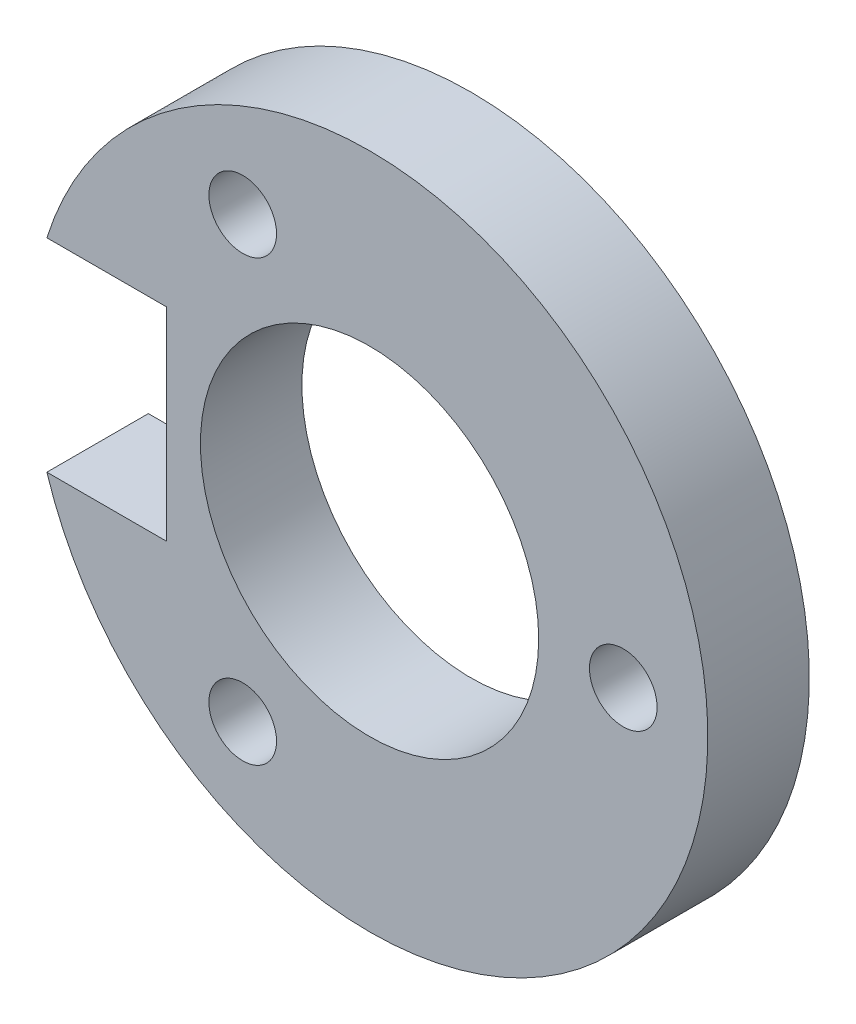
ISO-10303-21;
HEADER;
FILE_DESCRIPTION(('STEP AP214'),'2;1');
FILE_NAME('part.step','',(''),(''),'','','');
FILE_SCHEMA(('AUTOMOTIVE_DESIGN { 1 0 10303 214 1 1 1 1 }'));
ENDSEC;
DATA;
#1=APPLICATION_CONTEXT('core data for automotive mechanical design processes');
#2=APPLICATION_PROTOCOL_DEFINITION('international standard','automotive_design',2000,#1);
#3=PRODUCT_CONTEXT('',#1,'mechanical');
#4=PRODUCT('Part','Part','',(#3));
#5=PRODUCT_RELATED_PRODUCT_CATEGORY('part','',(#4));
#6=PRODUCT_DEFINITION_FORMATION('','',#4);
#7=PRODUCT_DEFINITION_CONTEXT('part definition',#1,'design');
#8=PRODUCT_DEFINITION('design','',#6,#7);
#9=PRODUCT_DEFINITION_SHAPE('','',#8);
#10=(LENGTH_UNIT() NAMED_UNIT(*) SI_UNIT(.MILLI.,.METRE.));
#11=(NAMED_UNIT(*) PLANE_ANGLE_UNIT() SI_UNIT($,.RADIAN.));
#12=(NAMED_UNIT(*) SI_UNIT($,.STERADIAN.) SOLID_ANGLE_UNIT());
#13=UNCERTAINTY_MEASURE_WITH_UNIT(LENGTH_MEASURE(1.E-05),#10,'distance_accuracy_value','');
#14=(GEOMETRIC_REPRESENTATION_CONTEXT(3) GLOBAL_UNCERTAINTY_ASSIGNED_CONTEXT((#13)) GLOBAL_UNIT_ASSIGNED_CONTEXT((#10,
#11,#12)) REPRESENTATION_CONTEXT('',''));
#15=CARTESIAN_POINT('',(0.,0.,0.));
#16=DIRECTION('',(0.,0.,1.));
#17=DIRECTION('',(1.,0.,0.));
#18=AXIS2_PLACEMENT_3D('',#15,#16,#17);
#19=CARTESIAN_POINT('',(-6.,0.,3.));
#20=DIRECTION('',(1.,0.,0.));
#21=DIRECTION('',(0.,0.,-1.));
#22=AXIS2_PLACEMENT_3D('',#19,#20,#21);
#23=PLANE('',#22);
#24=DIRECTION('',(0.,-1.,0.));
#25=VECTOR('',#24,1.);
#26=CARTESIAN_POINT('',(-6.,0.,0.));
#27=LINE('',#26,#25);
#28=CARTESIAN_POINT('',(-6.,3.,0.));
#29=VERTEX_POINT('',#28);
#30=CARTESIAN_POINT('',(-6.,-3.,0.));
#31=VERTEX_POINT('',#30);
#32=EDGE_CURVE('E115',#29,#31,#27,.T.);
#33=ORIENTED_EDGE('',*,*,#32,.T.);
#34=DIRECTION('',(0.,0.,-1.));
#35=VECTOR('',#34,1.);
#36=CARTESIAN_POINT('',(-6.,-3.,3.));
#37=LINE('',#36,#35);
#38=CARTESIAN_POINT('',(-6.,-3.,3.));
#39=VERTEX_POINT('',#38);
#40=EDGE_CURVE('E11',#39,#31,#37,.T.);
#41=ORIENTED_EDGE('',*,*,#40,.F.);
#42=DIRECTION('',(0.,-1.,0.));
#43=VECTOR('',#42,1.);
#44=CARTESIAN_POINT('',(-6.,0.,3.));
#45=LINE('',#44,#43);
#46=CARTESIAN_POINT('',(-6.,3.,3.));
#47=VERTEX_POINT('',#46);
#48=EDGE_CURVE('E80',#47,#39,#45,.T.);
#49=ORIENTED_EDGE('',*,*,#48,.F.);
#50=DIRECTION('',(0.,0.,-1.));
#51=VECTOR('',#50,1.);
#52=CARTESIAN_POINT('',(-6.,3.,3.));
#53=LINE('',#52,#51);
#54=EDGE_CURVE('E102',#47,#29,#53,.T.);
#55=ORIENTED_EDGE('',*,*,#54,.T.);
#56=EDGE_LOOP('',(#33,#41,#49,#55));
#57=FACE_BOUND('',#56,.T.);
#58=ADVANCED_FACE('F37',(#57),#23,.F.);
#59=CARTESIAN_POINT('',(0.,-3.,3.));
#60=DIRECTION('',(0.,1.,0.));
#61=DIRECTION('',(0.,0.,1.));
#62=AXIS2_PLACEMENT_3D('',#59,#60,#61);
#63=PLANE('',#62);
#64=DIRECTION('',(1.,0.,0.));
#65=VECTOR('',#64,1.);
#66=CARTESIAN_POINT('',(0.,-3.,0.));
#67=LINE('',#66,#65);
#68=CARTESIAN_POINT('',(-9.53939201416945,-3.,0.));
#69=VERTEX_POINT('',#68);
#70=EDGE_CURVE('E90',#69,#31,#67,.T.);
#71=ORIENTED_EDGE('',*,*,#70,.F.);
#72=DIRECTION('',(0.,0.,-1.));
#73=VECTOR('',#72,1.);
#74=CARTESIAN_POINT('',(-9.53939201416945,-3.,3.));
#75=LINE('',#74,#73);
#76=CARTESIAN_POINT('',(-9.53939201416945,-3.,3.));
#77=VERTEX_POINT('',#76);
#78=EDGE_CURVE('E46',#77,#69,#75,.T.);
#79=ORIENTED_EDGE('',*,*,#78,.F.);
#80=DIRECTION('',(1.,0.,0.));
#81=VECTOR('',#80,1.);
#82=CARTESIAN_POINT('',(0.,-3.,3.));
#83=LINE('',#82,#81);
#84=EDGE_CURVE('E88',#77,#39,#83,.T.);
#85=ORIENTED_EDGE('',*,*,#84,.T.);
#86=ORIENTED_EDGE('',*,*,#40,.T.);
#87=EDGE_LOOP('',(#71,#79,#85,#86));
#88=FACE_BOUND('',#87,.T.);
#89=ADVANCED_FACE('F87',(#88),#63,.T.);
#90=CARTESIAN_POINT('',(0.,0.,3.));
#91=DIRECTION('',(0.,0.,-1.));
#92=DIRECTION('',(-1.,0.,0.));
#93=AXIS2_PLACEMENT_3D('',#90,#91,#92);
#94=CYLINDRICAL_SURFACE('',#93,10.);
#95=CARTESIAN_POINT('',(0.,0.,0.));
#96=DIRECTION('',(0.,0.,1.));
#97=DIRECTION('',(1.,0.,0.));
#98=AXIS2_PLACEMENT_3D('',#95,#96,#97);
#99=CIRCLE('',#98,10.);
#100=CARTESIAN_POINT('',(-9.53939201416945,3.,0.));
#101=VERTEX_POINT('',#100);
#102=EDGE_CURVE('E69',#69,#101,#99,.T.);
#103=ORIENTED_EDGE('',*,*,#102,.T.);
#104=DIRECTION('',(0.,0.,-1.));
#105=VECTOR('',#104,1.);
#106=CARTESIAN_POINT('',(-9.53939201416945,3.,3.));
#107=LINE('',#106,#105);
#108=CARTESIAN_POINT('',(-9.53939201416945,3.,3.));
#109=VERTEX_POINT('',#108);
#110=EDGE_CURVE('E91',#109,#101,#107,.T.);
#111=ORIENTED_EDGE('',*,*,#110,.F.);
#112=CARTESIAN_POINT('',(0.,0.,3.));
#113=DIRECTION('',(0.,0.,1.));
#114=DIRECTION('',(1.,0.,0.));
#115=AXIS2_PLACEMENT_3D('',#112,#113,#114);
#116=CIRCLE('',#115,10.);
#117=EDGE_CURVE('E92',#77,#109,#116,.T.);
#118=ORIENTED_EDGE('',*,*,#117,.F.);
#119=ORIENTED_EDGE('',*,*,#78,.T.);
#120=EDGE_LOOP('',(#103,#111,#118,#119));
#121=FACE_BOUND('',#120,.T.);
#122=ADVANCED_FACE('F93',(#121),#94,.T.);
#123=CARTESIAN_POINT('',(7.5,0.,3.));
#124=DIRECTION('',(0.,0.,-1.));
#125=DIRECTION('',(-1.,0.,0.));
#126=AXIS2_PLACEMENT_3D('',#123,#124,#125);
#127=CYLINDRICAL_SURFACE('',#126,1.);
#128=CARTESIAN_POINT('',(7.5,0.,3.));
#129=DIRECTION('',(0.,0.,1.));
#130=DIRECTION('',(1.,0.,0.));
#131=AXIS2_PLACEMENT_3D('',#128,#129,#130);
#132=CIRCLE('',#131,1.);
#133=CARTESIAN_POINT('',(8.5,0.,3.));
#134=VERTEX_POINT('',#133);
#135=EDGE_CURVE('E97',#134,#134,#132,.T.);
#136=ORIENTED_EDGE('',*,*,#135,.T.);
#137=EDGE_LOOP('',(#136));
#138=FACE_BOUND('',#137,.T.);
#139=CARTESIAN_POINT('',(7.5,0.,0.));
#140=DIRECTION('',(0.,0.,1.));
#141=DIRECTION('',(1.,0.,0.));
#142=AXIS2_PLACEMENT_3D('',#139,#140,#141);
#143=CIRCLE('',#142,1.);
#144=CARTESIAN_POINT('',(8.5,0.,0.));
#145=VERTEX_POINT('',#144);
#146=EDGE_CURVE('E112',#145,#145,#143,.T.);
#147=ORIENTED_EDGE('',*,*,#146,.F.);
#148=EDGE_LOOP('',(#147));
#149=FACE_BOUND('',#148,.T.);
#150=ADVANCED_FACE('F136',(#138,#149),#127,.F.);
#151=CARTESIAN_POINT('',(-3.75000000000003,6.49519052838327,3.));
#152=DIRECTION('',(0.,0.,-1.));
#153=DIRECTION('',(-1.,0.,0.));
#154=AXIS2_PLACEMENT_3D('',#151,#152,#153);
#155=CYLINDRICAL_SURFACE('',#154,1.);
#156=CARTESIAN_POINT('',(-3.75000000000003,6.49519052838327,3.));
#157=DIRECTION('',(0.,0.,1.));
#158=DIRECTION('',(1.,0.,0.));
#159=AXIS2_PLACEMENT_3D('',#156,#157,#158);
#160=CIRCLE('',#159,1.);
#161=CARTESIAN_POINT('',(-2.75000000000003,6.49519052838327,3.));
#162=VERTEX_POINT('',#161);
#163=EDGE_CURVE('E272',#162,#162,#160,.T.);
#164=ORIENTED_EDGE('',*,*,#163,.T.);
#165=EDGE_LOOP('',(#164));
#166=FACE_BOUND('',#165,.T.);
#167=CARTESIAN_POINT('',(-3.75000000000003,6.49519052838327,0.));
#168=DIRECTION('',(0.,0.,1.));
#169=DIRECTION('',(1.,0.,0.));
#170=AXIS2_PLACEMENT_3D('',#167,#168,#169);
#171=CIRCLE('',#170,1.);
#172=CARTESIAN_POINT('',(-2.75000000000003,6.49519052838327,0.));
#173=VERTEX_POINT('',#172);
#174=EDGE_CURVE('E109',#173,#173,#171,.T.);
#175=ORIENTED_EDGE('',*,*,#174,.F.);
#176=EDGE_LOOP('',(#175));
#177=FACE_BOUND('',#176,.T.);
#178=ADVANCED_FACE('F139',(#166,#177),#155,.F.);
#179=CARTESIAN_POINT('',(0.,0.,3.));
#180=DIRECTION('',(0.,0.,-1.));
#181=DIRECTION('',(-1.,0.,0.));
#182=AXIS2_PLACEMENT_3D('',#179,#180,#181);
#183=CYLINDRICAL_SURFACE('',#182,5.);
#184=CARTESIAN_POINT('',(0.,0.,3.));
#185=DIRECTION('',(0.,0.,1.));
#186=DIRECTION('',(1.,0.,0.));
#187=AXIS2_PLACEMENT_3D('',#184,#185,#186);
#188=CIRCLE('',#187,5.);
#189=CARTESIAN_POINT('',(5.,0.,3.));
#190=VERTEX_POINT('',#189);
#191=EDGE_CURVE('E153',#190,#190,#188,.T.);
#192=ORIENTED_EDGE('',*,*,#191,.T.);
#193=EDGE_LOOP('',(#192));
#194=FACE_BOUND('',#193,.T.);
#195=CARTESIAN_POINT('',(0.,0.,0.));
#196=DIRECTION('',(0.,0.,1.));
#197=DIRECTION('',(1.,0.,0.));
#198=AXIS2_PLACEMENT_3D('',#195,#196,#197);
#199=CIRCLE('',#198,5.);
#200=CARTESIAN_POINT('',(5.,0.,0.));
#201=VERTEX_POINT('',#200);
#202=EDGE_CURVE('E106',#201,#201,#199,.T.);
#203=ORIENTED_EDGE('',*,*,#202,.F.);
#204=EDGE_LOOP('',(#203));
#205=FACE_BOUND('',#204,.T.);
#206=ADVANCED_FACE('F142',(#194,#205),#183,.F.);
#207=CARTESIAN_POINT('',(-3.74999999999994,-6.49519052838332,3.));
#208=DIRECTION('',(0.,0.,-1.));
#209=DIRECTION('',(-1.,0.,0.));
#210=AXIS2_PLACEMENT_3D('',#207,#208,#209);
#211=CYLINDRICAL_SURFACE('',#210,1.);
#212=CARTESIAN_POINT('',(-3.74999999999994,-6.49519052838332,3.));
#213=DIRECTION('',(0.,0.,1.));
#214=DIRECTION('',(1.,0.,0.));
#215=AXIS2_PLACEMENT_3D('',#212,#213,#214);
#216=CIRCLE('',#215,1.);
#217=CARTESIAN_POINT('',(-2.74999999999994,-6.49519052838332,3.));
#218=VERTEX_POINT('',#217);
#219=EDGE_CURVE('E121',#218,#218,#216,.T.);
#220=ORIENTED_EDGE('',*,*,#219,.T.);
#221=EDGE_LOOP('',(#220));
#222=FACE_BOUND('',#221,.T.);
#223=CARTESIAN_POINT('',(-3.74999999999994,-6.49519052838332,0.));
#224=DIRECTION('',(0.,0.,1.));
#225=DIRECTION('',(1.,0.,0.));
#226=AXIS2_PLACEMENT_3D('',#223,#224,#225);
#227=CIRCLE('',#226,1.);
#228=CARTESIAN_POINT('',(-2.74999999999994,-6.49519052838332,0.));
#229=VERTEX_POINT('',#228);
#230=EDGE_CURVE('E103',#229,#229,#227,.T.);
#231=ORIENTED_EDGE('',*,*,#230,.F.);
#232=EDGE_LOOP('',(#231));
#233=FACE_BOUND('',#232,.T.);
#234=ADVANCED_FACE('F39',(#222,#233),#211,.F.);
#235=CARTESIAN_POINT('',(0.,3.,3.));
#236=DIRECTION('',(0.,1.,0.));
#237=DIRECTION('',(0.,0.,1.));
#238=AXIS2_PLACEMENT_3D('',#235,#236,#237);
#239=PLANE('',#238);
#240=DIRECTION('',(1.,0.,0.));
#241=VECTOR('',#240,1.);
#242=CARTESIAN_POINT('',(0.,3.,0.));
#243=LINE('',#242,#241);
#244=EDGE_CURVE('E75',#101,#29,#243,.T.);
#245=ORIENTED_EDGE('',*,*,#244,.T.);
#246=ORIENTED_EDGE('',*,*,#54,.F.);
#247=DIRECTION('',(1.,0.,0.));
#248=VECTOR('',#247,1.);
#249=CARTESIAN_POINT('',(0.,3.,3.));
#250=LINE('',#249,#248);
#251=EDGE_CURVE('E54',#109,#47,#250,.T.);
#252=ORIENTED_EDGE('',*,*,#251,.F.);
#253=ORIENTED_EDGE('',*,*,#110,.T.);
#254=EDGE_LOOP('',(#245,#246,#252,#253));
#255=FACE_BOUND('',#254,.T.);
#256=ADVANCED_FACE('F123',(#255),#239,.F.);
#257=CARTESIAN_POINT('',(0.,0.,3.));
#258=DIRECTION('',(0.,0.,1.));
#259=DIRECTION('',(1.,0.,0.));
#260=AXIS2_PLACEMENT_3D('',#257,#258,#259);
#261=PLANE('',#260);
#262=ORIENTED_EDGE('',*,*,#219,.F.);
#263=EDGE_LOOP('',(#262));
#264=FACE_BOUND('',#263,.T.);
#265=ORIENTED_EDGE('',*,*,#191,.F.);
#266=EDGE_LOOP('',(#265));
#267=FACE_BOUND('',#266,.T.);
#268=ORIENTED_EDGE('',*,*,#163,.F.);
#269=EDGE_LOOP('',(#268));
#270=FACE_BOUND('',#269,.T.);
#271=ORIENTED_EDGE('',*,*,#135,.F.);
#272=EDGE_LOOP('',(#271));
#273=FACE_BOUND('',#272,.T.);
#274=ORIENTED_EDGE('',*,*,#48,.T.);
#275=ORIENTED_EDGE('',*,*,#84,.F.);
#276=ORIENTED_EDGE('',*,*,#117,.T.);
#277=ORIENTED_EDGE('',*,*,#251,.T.);
#278=EDGE_LOOP('',(#274,#275,#276,#277));
#279=FACE_BOUND('',#278,.T.);
#280=ADVANCED_FACE('F95',(#264,#267,#270,#273,#279),#261,.T.);
#281=CARTESIAN_POINT('',(0.,0.,0.));
#282=DIRECTION('',(0.,0.,1.));
#283=DIRECTION('',(1.,0.,0.));
#284=AXIS2_PLACEMENT_3D('',#281,#282,#283);
#285=PLANE('',#284);
#286=ORIENTED_EDGE('',*,*,#230,.T.);
#287=EDGE_LOOP('',(#286));
#288=FACE_BOUND('',#287,.T.);
#289=ORIENTED_EDGE('',*,*,#202,.T.);
#290=EDGE_LOOP('',(#289));
#291=FACE_BOUND('',#290,.T.);
#292=ORIENTED_EDGE('',*,*,#174,.T.);
#293=EDGE_LOOP('',(#292));
#294=FACE_BOUND('',#293,.T.);
#295=ORIENTED_EDGE('',*,*,#146,.T.);
#296=EDGE_LOOP('',(#295));
#297=FACE_BOUND('',#296,.T.);
#298=ORIENTED_EDGE('',*,*,#32,.F.);
#299=ORIENTED_EDGE('',*,*,#244,.F.);
#300=ORIENTED_EDGE('',*,*,#102,.F.);
#301=ORIENTED_EDGE('',*,*,#70,.T.);
#302=EDGE_LOOP('',(#298,#299,#300,#301));
#303=FACE_BOUND('',#302,.T.);
#304=ADVANCED_FACE('F126',(#288,#291,#294,#297,#303),#285,.F.);
#305=CLOSED_SHELL('',(#58,#89,#122,#150,#178,#206,#234,#256,#280,#304));
#306=MANIFOLD_SOLID_BREP('B2',#305);
#307=ADVANCED_BREP_SHAPE_REPRESENTATION('',(#18,#306),#14);
#308=SHAPE_DEFINITION_REPRESENTATION(#9,#307);
ENDSEC;
END-ISO-10303-21;
